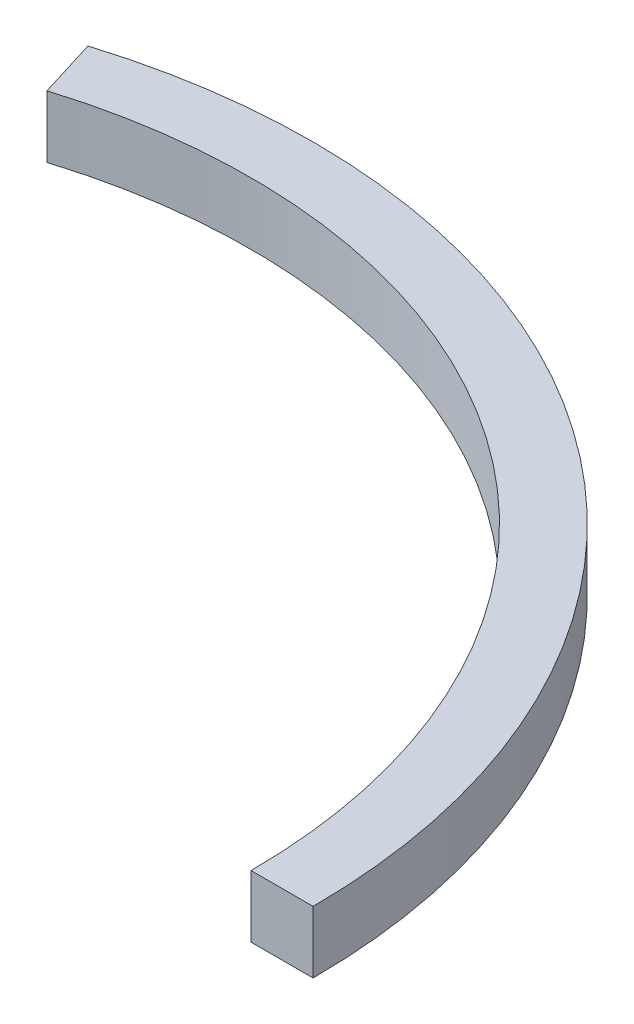
ISO-10303-21;
HEADER;
FILE_DESCRIPTION(('STEP AP214'),'2;1');
FILE_NAME('part.step','',(''),(''),'','','');
FILE_SCHEMA(('AUTOMOTIVE_DESIGN { 1 0 10303 214 1 1 1 1 }'));
ENDSEC;
DATA;
#1=APPLICATION_CONTEXT('core data for automotive mechanical design processes');
#2=APPLICATION_PROTOCOL_DEFINITION('international standard','automotive_design',2000,#1);
#3=PRODUCT_CONTEXT('',#1,'mechanical');
#4=PRODUCT('Part','Part','',(#3));
#5=PRODUCT_RELATED_PRODUCT_CATEGORY('part','',(#4));
#6=PRODUCT_DEFINITION_FORMATION('','',#4);
#7=PRODUCT_DEFINITION_CONTEXT('part definition',#1,'design');
#8=PRODUCT_DEFINITION('design','',#6,#7);
#9=PRODUCT_DEFINITION_SHAPE('','',#8);
#10=(LENGTH_UNIT() NAMED_UNIT(*) SI_UNIT(.MILLI.,.METRE.));
#11=(NAMED_UNIT(*) PLANE_ANGLE_UNIT() SI_UNIT($,.RADIAN.));
#12=(NAMED_UNIT(*) SI_UNIT($,.STERADIAN.) SOLID_ANGLE_UNIT());
#13=UNCERTAINTY_MEASURE_WITH_UNIT(LENGTH_MEASURE(1.E-05),#10,'distance_accuracy_value','');
#14=(GEOMETRIC_REPRESENTATION_CONTEXT(3) GLOBAL_UNCERTAINTY_ASSIGNED_CONTEXT((#13)) GLOBAL_UNIT_ASSIGNED_CONTEXT((#10,
#11,#12)) REPRESENTATION_CONTEXT('',''));
#15=CARTESIAN_POINT('',(0.,0.,0.));
#16=DIRECTION('',(0.,0.,1.));
#17=DIRECTION('',(1.,0.,0.));
#18=AXIS2_PLACEMENT_3D('',#15,#16,#17);
#19=CARTESIAN_POINT('',(0.,0.,0.));
#20=DIRECTION('',(0.,0.,1.));
#21=DIRECTION('',(1.,0.,0.));
#22=AXIS2_PLACEMENT_3D('',#19,#20,#21);
#23=PLANE('',#22);
#24=DIRECTION('',(0.,1.,0.));
#25=VECTOR('',#24,1.);
#26=CARTESIAN_POINT('',(55.1557268963876,-1.12525382179795,0.));
#27=LINE('',#26,#25);
#28=CARTESIAN_POINT('',(55.1557268963876,-1.12525382179795,0.));
#29=VERTEX_POINT('',#28);
#30=CARTESIAN_POINT('',(55.1557268963876,3.87474617820205,0.));
#31=VERTEX_POINT('',#30);
#32=EDGE_CURVE('E86',#29,#31,#27,.T.);
#33=ORIENTED_EDGE('',*,*,#32,.T.);
#34=DIRECTION('',(-1.,0.,0.));
#35=VECTOR('',#34,1.);
#36=CARTESIAN_POINT('',(55.1557268963876,3.87474617820205,0.));
#37=LINE('',#36,#35);
#38=CARTESIAN_POINT('',(50.1557268963876,3.87474617820205,0.));
#39=VERTEX_POINT('',#38);
#40=EDGE_CURVE('E79',#31,#39,#37,.T.);
#41=ORIENTED_EDGE('',*,*,#40,.T.);
#42=DIRECTION('',(0.,-1.,0.));
#43=VECTOR('',#42,1.);
#44=CARTESIAN_POINT('',(50.1557268963876,-1.12525382179795,0.));
#45=LINE('',#44,#43);
#46=CARTESIAN_POINT('',(50.1557268963876,-1.12525382179795,0.));
#47=VERTEX_POINT('',#46);
#48=EDGE_CURVE('E74',#39,#47,#45,.T.);
#49=ORIENTED_EDGE('',*,*,#48,.T.);
#50=DIRECTION('',(1.,0.,0.));
#51=VECTOR('',#50,1.);
#52=CARTESIAN_POINT('',(55.1557268963876,-1.12525382179795,0.));
#53=LINE('',#52,#51);
#54=EDGE_CURVE('E69',#47,#29,#53,.T.);
#55=ORIENTED_EDGE('',*,*,#54,.T.);
#56=EDGE_LOOP('',(#33,#41,#49,#55));
#57=FACE_BOUND('',#56,.T.);
#58=ADVANCED_FACE('F34',(#57),#23,.T.);
#59=CARTESIAN_POINT('',(2.33208737698424,0.,1.71984844227163));
#60=DIRECTION('',(0.955358058964174,0.,-0.295450468221333));
#61=DIRECTION('',(-0.295450468221333,0.,-0.955358058964174));
#62=AXIS2_PLACEMENT_3D('',#59,#60,#61);
#63=PLANE('',#62);
#64=DIRECTION('',(0.,1.,0.));
#65=VECTOR('',#64,1.);
#66=CARTESIAN_POINT('',(-13.9636979596415,-1.12525382179795,-50.9736197462193));
#67=LINE('',#66,#65);
#68=CARTESIAN_POINT('',(-13.9636979596415,-1.12525382179795,-50.9736197462193));
#69=VERTEX_POINT('',#68);
#70=CARTESIAN_POINT('',(-13.9636979596415,3.87474617820205,-50.9736197462193));
#71=VERTEX_POINT('',#70);
#72=EDGE_CURVE('E94',#69,#71,#67,.T.);
#73=ORIENTED_EDGE('',*,*,#72,.F.);
#74=DIRECTION('',(-0.295450468221333,0.,-0.955358058964174));
#75=VECTOR('',#74,1.);
#76=CARTESIAN_POINT('',(-13.9636979596415,-1.12525382179795,-50.9736197462193));
#77=LINE('',#76,#75);
#78=CARTESIAN_POINT('',(-12.4864456185348,-1.12525382179795,-46.1968294513985));
#79=VERTEX_POINT('',#78);
#80=EDGE_CURVE('E11',#79,#69,#77,.T.);
#81=ORIENTED_EDGE('',*,*,#80,.F.);
#82=DIRECTION('',(0.,-1.,0.));
#83=VECTOR('',#82,1.);
#84=CARTESIAN_POINT('',(-12.4864456185348,-1.12525382179795,-46.1968294513985));
#85=LINE('',#84,#83);
#86=CARTESIAN_POINT('',(-12.4864456185348,3.87474617820205,-46.1968294513985));
#87=VERTEX_POINT('',#86);
#88=EDGE_CURVE('E48',#87,#79,#85,.T.);
#89=ORIENTED_EDGE('',*,*,#88,.F.);
#90=DIRECTION('',(0.295450468221333,0.,0.955358058964174));
#91=VECTOR('',#90,1.);
#92=CARTESIAN_POINT('',(-13.9636979596415,3.87474617820205,-50.9736197462193));
#93=LINE('',#92,#91);
#94=EDGE_CURVE('E57',#71,#87,#93,.T.);
#95=ORIENTED_EDGE('',*,*,#94,.F.);
#96=EDGE_LOOP('',(#73,#81,#89,#95));
#97=FACE_BOUND('',#96,.T.);
#98=ADVANCED_FACE('F116',(#97),#63,.F.);
#99=CARTESIAN_POINT('',(1.80021346565741,5.01705367675014,0.));
#100=DIRECTION('',(0.,1.,0.));
#101=DIRECTION('',(0.,0.,1.));
#102=AXIS2_PLACEMENT_3D('',#99,#100,#101);
#103=CYLINDRICAL_SURFACE('',#102,53.3555134307302);
#104=CARTESIAN_POINT('',(1.80021346565741,3.87474617820205,0.));
#105=DIRECTION('',(0.,1.,0.));
#106=DIRECTION('',(1.,0.,0.));
#107=AXIS2_PLACEMENT_3D('',#104,#105,#106);
#108=CIRCLE('',#107,53.3555134307302);
#109=EDGE_CURVE('E89',#31,#71,#108,.T.);
#110=ORIENTED_EDGE('',*,*,#109,.F.);
#111=ORIENTED_EDGE('',*,*,#32,.F.);
#112=CARTESIAN_POINT('',(1.80021346565741,-1.12525382179795,0.));
#113=DIRECTION('',(0.,1.,0.));
#114=DIRECTION('',(1.,0.,0.));
#115=AXIS2_PLACEMENT_3D('',#112,#113,#114);
#116=CIRCLE('',#115,53.3555134307302);
#117=EDGE_CURVE('E88',#29,#69,#116,.T.);
#118=ORIENTED_EDGE('',*,*,#117,.T.);
#119=ORIENTED_EDGE('',*,*,#72,.T.);
#120=EDGE_LOOP('',(#110,#111,#118,#119));
#121=FACE_BOUND('',#120,.T.);
#122=ADVANCED_FACE('F87',(#121),#103,.T.);
#123=CARTESIAN_POINT('',(55.1557268963876,3.87474617820205,0.));
#124=DIRECTION('',(0.,-1.,0.));
#125=DIRECTION('',(0.,0.,-1.));
#126=AXIS2_PLACEMENT_3D('',#123,#124,#125);
#127=PLANE('',#126);
#128=CARTESIAN_POINT('',(1.80021346565741,3.87474617820205,0.));
#129=DIRECTION('',(0.,1.,0.));
#130=DIRECTION('',(1.,0.,0.));
#131=AXIS2_PLACEMENT_3D('',#128,#129,#130);
#132=CIRCLE('',#131,48.3555134307302);
#133=EDGE_CURVE('E101',#39,#87,#132,.T.);
#134=ORIENTED_EDGE('',*,*,#133,.F.);
#135=ORIENTED_EDGE('',*,*,#40,.F.);
#136=ORIENTED_EDGE('',*,*,#109,.T.);
#137=ORIENTED_EDGE('',*,*,#94,.T.);
#138=EDGE_LOOP('',(#134,#135,#136,#137));
#139=FACE_BOUND('',#138,.T.);
#140=ADVANCED_FACE('F107',(#139),#127,.F.);
#141=CARTESIAN_POINT('',(1.80021346565741,5.01705367675014,0.));
#142=DIRECTION('',(0.,1.,0.));
#143=DIRECTION('',(0.,0.,1.));
#144=AXIS2_PLACEMENT_3D('',#141,#142,#143);
#145=CYLINDRICAL_SURFACE('',#144,48.3555134307302);
#146=CARTESIAN_POINT('',(1.80021346565741,-1.12525382179795,0.));
#147=DIRECTION('',(0.,1.,0.));
#148=DIRECTION('',(1.,0.,0.));
#149=AXIS2_PLACEMENT_3D('',#146,#147,#148);
#150=CIRCLE('',#149,48.3555134307302);
#151=EDGE_CURVE('E41',#47,#79,#150,.T.);
#152=ORIENTED_EDGE('',*,*,#151,.F.);
#153=ORIENTED_EDGE('',*,*,#48,.F.);
#154=ORIENTED_EDGE('',*,*,#133,.T.);
#155=ORIENTED_EDGE('',*,*,#88,.T.);
#156=EDGE_LOOP('',(#152,#153,#154,#155));
#157=FACE_BOUND('',#156,.T.);
#158=ADVANCED_FACE('F105',(#157),#145,.F.);
#159=CARTESIAN_POINT('',(55.1557268963876,-1.12525382179795,0.));
#160=DIRECTION('',(0.,1.,0.));
#161=DIRECTION('',(0.,0.,1.));
#162=AXIS2_PLACEMENT_3D('',#159,#160,#161);
#163=PLANE('',#162);
#164=ORIENTED_EDGE('',*,*,#80,.T.);
#165=ORIENTED_EDGE('',*,*,#117,.F.);
#166=ORIENTED_EDGE('',*,*,#54,.F.);
#167=ORIENTED_EDGE('',*,*,#151,.T.);
#168=EDGE_LOOP('',(#164,#165,#166,#167));
#169=FACE_BOUND('',#168,.T.);
#170=ADVANCED_FACE('F92',(#169),#163,.F.);
#171=CLOSED_SHELL('',(#58,#98,#122,#140,#158,#170));
#172=MANIFOLD_SOLID_BREP('B2',#171);
#173=ADVANCED_BREP_SHAPE_REPRESENTATION('',(#18,#172),#14);
#174=SHAPE_DEFINITION_REPRESENTATION(#9,#173);
ENDSEC;
END-ISO-10303-21;
